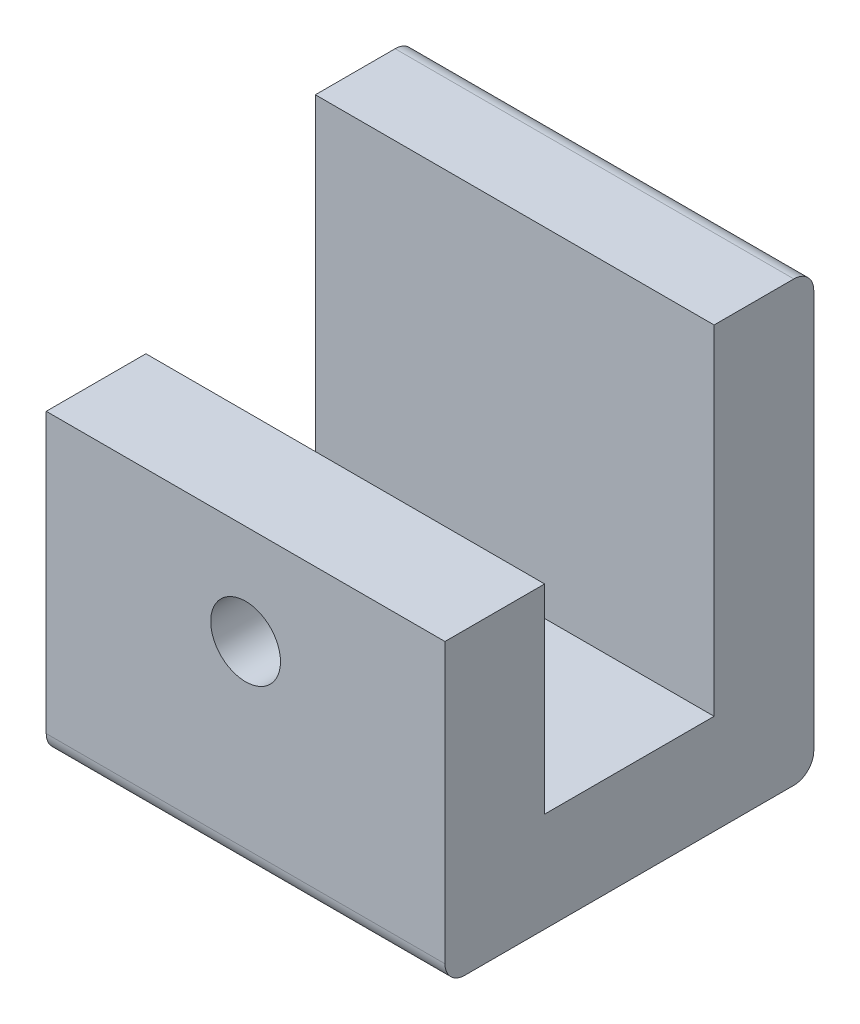
ISO-10303-21;
HEADER;
FILE_DESCRIPTION(('STEP AP214'),'2;1');
FILE_NAME('part.step','',(''),(''),'','','');
FILE_SCHEMA(('AUTOMOTIVE_DESIGN { 1 0 10303 214 1 1 1 1 }'));
ENDSEC;
DATA;
#1=APPLICATION_CONTEXT('core data for automotive mechanical design processes');
#2=APPLICATION_PROTOCOL_DEFINITION('international standard','automotive_design',2000,#1);
#3=PRODUCT_CONTEXT('',#1,'mechanical');
#4=PRODUCT('Part','Part','',(#3));
#5=PRODUCT_RELATED_PRODUCT_CATEGORY('part','',(#4));
#6=PRODUCT_DEFINITION_FORMATION('','',#4);
#7=PRODUCT_DEFINITION_CONTEXT('part definition',#1,'design');
#8=PRODUCT_DEFINITION('design','',#6,#7);
#9=PRODUCT_DEFINITION_SHAPE('','',#8);
#10=(LENGTH_UNIT() NAMED_UNIT(*) SI_UNIT(.MILLI.,.METRE.));
#11=(NAMED_UNIT(*) PLANE_ANGLE_UNIT() SI_UNIT($,.RADIAN.));
#12=(NAMED_UNIT(*) SI_UNIT($,.STERADIAN.) SOLID_ANGLE_UNIT());
#13=UNCERTAINTY_MEASURE_WITH_UNIT(LENGTH_MEASURE(1.E-05),#10,'distance_accuracy_value','');
#14=(GEOMETRIC_REPRESENTATION_CONTEXT(3) GLOBAL_UNCERTAINTY_ASSIGNED_CONTEXT((#13)) GLOBAL_UNIT_ASSIGNED_CONTEXT((#10,
#11,#12)) REPRESENTATION_CONTEXT('',''));
#15=CARTESIAN_POINT('',(0.,0.,0.));
#16=DIRECTION('',(0.,0.,1.));
#17=DIRECTION('',(1.,0.,0.));
#18=AXIS2_PLACEMENT_3D('',#15,#16,#17);
#19=CARTESIAN_POINT('',(10.,-2.5,-13.5));
#20=DIRECTION('',(0.,-1.,0.));
#21=DIRECTION('',(1.,0.,0.));
#22=AXIS2_PLACEMENT_3D('',#19,#20,#21);
#23=PLANE('',#22);
#24=DIRECTION('',(1.,0.,0.));
#25=VECTOR('',#24,1.);
#26=CARTESIAN_POINT('',(10.,-2.5,-8.5));
#27=LINE('',#26,#25);
#28=CARTESIAN_POINT('',(-10.,-2.5,-8.5));
#29=VERTEX_POINT('',#28);
#30=CARTESIAN_POINT('',(10.,-2.5,-8.5));
#31=VERTEX_POINT('',#30);
#32=EDGE_CURVE('E158',#29,#31,#27,.T.);
#33=ORIENTED_EDGE('',*,*,#32,.F.);
#34=DIRECTION('',(0.,0.,1.));
#35=VECTOR('',#34,1.);
#36=CARTESIAN_POINT('',(-10.,-2.5,-13.5));
#37=LINE('',#36,#35);
#38=CARTESIAN_POINT('',(-10.,-2.5,0.));
#39=VERTEX_POINT('',#38);
#40=EDGE_CURVE('E142',#29,#39,#37,.T.);
#41=ORIENTED_EDGE('',*,*,#40,.T.);
#42=DIRECTION('',(1.,0.,0.));
#43=VECTOR('',#42,1.);
#44=CARTESIAN_POINT('',(10.,-2.5,0.));
#45=LINE('',#44,#43);
#46=CARTESIAN_POINT('',(10.,-2.5,0.));
#47=VERTEX_POINT('',#46);
#48=EDGE_CURVE('E146',#39,#47,#45,.T.);
#49=ORIENTED_EDGE('',*,*,#48,.T.);
#50=DIRECTION('',(0.,0.,1.));
#51=VECTOR('',#50,1.);
#52=CARTESIAN_POINT('',(10.,-2.5,-13.5));
#53=LINE('',#52,#51);
#54=EDGE_CURVE('E169',#31,#47,#53,.T.);
#55=ORIENTED_EDGE('',*,*,#54,.F.);
#56=EDGE_LOOP('',(#33,#41,#49,#55));
#57=FACE_BOUND('',#56,.T.);
#58=ADVANCED_FACE('F41',(#57),#23,.F.);
#59=CARTESIAN_POINT('',(0.,0.,0.));
#60=DIRECTION('',(0.,0.,1.));
#61=DIRECTION('',(1.,0.,0.));
#62=AXIS2_PLACEMENT_3D('',#59,#60,#61);
#63=PLANE('',#62);
#64=CARTESIAN_POINT('',(0.,2.5,0.));
#65=DIRECTION('',(0.,0.,1.));
#66=DIRECTION('',(1.,0.,0.));
#67=AXIS2_PLACEMENT_3D('',#64,#65,#66);
#68=CIRCLE('',#67,1.75);
#69=CARTESIAN_POINT('',(1.75,2.5,0.));
#70=VERTEX_POINT('',#69);
#71=EDGE_CURVE('E177',#70,#70,#68,.T.);
#72=ORIENTED_EDGE('',*,*,#71,.T.);
#73=EDGE_LOOP('',(#72));
#74=FACE_BOUND('',#73,.T.);
#75=ORIENTED_EDGE('',*,*,#48,.F.);
#76=DIRECTION('',(0.,-1.,0.));
#77=VECTOR('',#76,1.);
#78=CARTESIAN_POINT('',(-10.,0.,0.));
#79=LINE('',#78,#77);
#80=CARTESIAN_POINT('',(-10.,7.5,0.));
#81=VERTEX_POINT('',#80);
#82=EDGE_CURVE('E197',#81,#39,#79,.T.);
#83=ORIENTED_EDGE('',*,*,#82,.F.);
#84=DIRECTION('',(-1.,0.,0.));
#85=VECTOR('',#84,1.);
#86=CARTESIAN_POINT('',(0.,7.5,0.));
#87=LINE('',#86,#85);
#88=CARTESIAN_POINT('',(10.,7.5,0.));
#89=VERTEX_POINT('',#88);
#90=EDGE_CURVE('E183',#89,#81,#87,.T.);
#91=ORIENTED_EDGE('',*,*,#90,.F.);
#92=DIRECTION('',(0.,-1.,0.));
#93=VECTOR('',#92,1.);
#94=CARTESIAN_POINT('',(10.,0.,0.));
#95=LINE('',#94,#93);
#96=EDGE_CURVE('E200',#89,#47,#95,.T.);
#97=ORIENTED_EDGE('',*,*,#96,.T.);
#98=EDGE_LOOP('',(#75,#83,#91,#97));
#99=FACE_BOUND('',#98,.T.);
#100=ADVANCED_FACE('F275',(#74,#99),#63,.F.);
#101=CARTESIAN_POINT('',(-10.,0.,5.));
#102=DIRECTION('',(1.,0.,0.));
#103=DIRECTION('',(0.,0.,-1.));
#104=AXIS2_PLACEMENT_3D('',#101,#102,#103);
#105=PLANE('',#104);
#106=DIRECTION('',(0.,0.,1.));
#107=VECTOR('',#106,1.);
#108=CARTESIAN_POINT('',(-10.,14.5,-13.5));
#109=LINE('',#108,#107);
#110=CARTESIAN_POINT('',(-10.,14.5,-12.5));
#111=VERTEX_POINT('',#110);
#112=CARTESIAN_POINT('',(-10.,14.5,-8.5));
#113=VERTEX_POINT('',#112);
#114=EDGE_CURVE('E125',#111,#113,#109,.T.);
#115=ORIENTED_EDGE('',*,*,#114,.F.);
#116=CARTESIAN_POINT('',(-10.,13.5,-12.5));
#117=DIRECTION('',(1.,0.,0.));
#118=DIRECTION('',(0.,0.,-1.));
#119=AXIS2_PLACEMENT_3D('',#116,#117,#118);
#120=CIRCLE('',#119,1.);
#121=CARTESIAN_POINT('',(-10.,13.5,-13.5));
#122=VERTEX_POINT('',#121);
#123=EDGE_CURVE('E226',#111,#122,#120,.F.);
#124=ORIENTED_EDGE('',*,*,#123,.T.);
#125=DIRECTION('',(0.,1.,0.));
#126=VECTOR('',#125,1.);
#127=CARTESIAN_POINT('',(-10.,-7.5,-13.5));
#128=LINE('',#127,#126);
#129=CARTESIAN_POINT('',(-10.,-6.5,-13.5));
#130=VERTEX_POINT('',#129);
#131=EDGE_CURVE('E165',#130,#122,#128,.T.);
#132=ORIENTED_EDGE('',*,*,#131,.F.);
#133=CARTESIAN_POINT('',(-10.,-6.5,-12.5));
#134=DIRECTION('',(1.,0.,0.));
#135=DIRECTION('',(0.,0.,-1.));
#136=AXIS2_PLACEMENT_3D('',#133,#134,#135);
#137=CIRCLE('',#136,1.);
#138=CARTESIAN_POINT('',(-10.,-7.5,-12.5));
#139=VERTEX_POINT('',#138);
#140=EDGE_CURVE('E223',#130,#139,#137,.F.);
#141=ORIENTED_EDGE('',*,*,#140,.T.);
#142=DIRECTION('',(0.,0.,-1.));
#143=VECTOR('',#142,1.);
#144=CARTESIAN_POINT('',(-10.,-7.5,5.));
#145=LINE('',#144,#143);
#146=CARTESIAN_POINT('',(-10.,-7.5,4.));
#147=VERTEX_POINT('',#146);
#148=EDGE_CURVE('E215',#147,#139,#145,.T.);
#149=ORIENTED_EDGE('',*,*,#148,.F.);
#150=CARTESIAN_POINT('',(-10.,-6.5,4.));
#151=DIRECTION('',(1.,0.,0.));
#152=DIRECTION('',(0.,0.,-1.));
#153=AXIS2_PLACEMENT_3D('',#150,#151,#152);
#154=CIRCLE('',#153,1.);
#155=CARTESIAN_POINT('',(-10.,-6.5,5.));
#156=VERTEX_POINT('',#155);
#157=EDGE_CURVE('E220',#147,#156,#154,.F.);
#158=ORIENTED_EDGE('',*,*,#157,.T.);
#159=DIRECTION('',(0.,-1.,0.));
#160=VECTOR('',#159,1.);
#161=CARTESIAN_POINT('',(-10.,0.,5.));
#162=LINE('',#161,#160);
#163=CARTESIAN_POINT('',(-10.,7.5,5.));
#164=VERTEX_POINT('',#163);
#165=EDGE_CURVE('E182',#164,#156,#162,.T.);
#166=ORIENTED_EDGE('',*,*,#165,.F.);
#167=DIRECTION('',(0.,0.,-1.));
#168=VECTOR('',#167,1.);
#169=CARTESIAN_POINT('',(-10.,7.5,5.));
#170=LINE('',#169,#168);
#171=EDGE_CURVE('E193',#164,#81,#170,.T.);
#172=ORIENTED_EDGE('',*,*,#171,.T.);
#173=ORIENTED_EDGE('',*,*,#82,.T.);
#174=ORIENTED_EDGE('',*,*,#40,.F.);
#175=DIRECTION('',(0.,-1.,0.));
#176=VECTOR('',#175,1.);
#177=CARTESIAN_POINT('',(-10.,14.5,-8.5));
#178=LINE('',#177,#176);
#179=EDGE_CURVE('E139',#113,#29,#178,.T.);
#180=ORIENTED_EDGE('',*,*,#179,.F.);
#181=EDGE_LOOP('',(#115,#124,#132,#141,#149,#158,#166,#172,#173,#174,#180));
#182=FACE_BOUND('',#181,.T.);
#183=ADVANCED_FACE('F140',(#182),#105,.F.);
#184=CARTESIAN_POINT('',(0.,-7.5,5.));
#185=DIRECTION('',(0.,-1.,0.));
#186=DIRECTION('',(1.,0.,0.));
#187=AXIS2_PLACEMENT_3D('',#184,#185,#186);
#188=PLANE('',#187);
#189=ORIENTED_EDGE('',*,*,#148,.T.);
#190=DIRECTION('',(-1.,0.,0.));
#191=VECTOR('',#190,1.);
#192=CARTESIAN_POINT('',(10.,-7.5,-12.5));
#193=LINE('',#192,#191);
#194=CARTESIAN_POINT('',(10.,-7.5,-12.5));
#195=VERTEX_POINT('',#194);
#196=EDGE_CURVE('E50',#139,#195,#193,.F.);
#197=ORIENTED_EDGE('',*,*,#196,.T.);
#198=DIRECTION('',(0.,0.,-1.));
#199=VECTOR('',#198,1.);
#200=CARTESIAN_POINT('',(10.,-7.5,5.));
#201=LINE('',#200,#199);
#202=CARTESIAN_POINT('',(10.,-7.5,4.));
#203=VERTEX_POINT('',#202);
#204=EDGE_CURVE('E212',#203,#195,#201,.T.);
#205=ORIENTED_EDGE('',*,*,#204,.F.);
#206=DIRECTION('',(-1.,0.,0.));
#207=VECTOR('',#206,1.);
#208=CARTESIAN_POINT('',(0.,-7.5,4.));
#209=LINE('',#208,#207);
#210=EDGE_CURVE('E244',#203,#147,#209,.T.);
#211=ORIENTED_EDGE('',*,*,#210,.T.);
#212=EDGE_LOOP('',(#189,#197,#205,#211));
#213=FACE_BOUND('',#212,.T.);
#214=ADVANCED_FACE('F250',(#213),#188,.T.);
#215=CARTESIAN_POINT('',(10.,0.,5.));
#216=DIRECTION('',(1.,0.,0.));
#217=DIRECTION('',(0.,1.,0.));
#218=AXIS2_PLACEMENT_3D('',#215,#216,#217);
#219=PLANE('',#218);
#220=DIRECTION('',(0.,-1.,0.));
#221=VECTOR('',#220,1.);
#222=CARTESIAN_POINT('',(10.,-7.5,-13.5));
#223=LINE('',#222,#221);
#224=CARTESIAN_POINT('',(10.,13.5,-13.5));
#225=VERTEX_POINT('',#224);
#226=CARTESIAN_POINT('',(10.,-6.5,-13.5));
#227=VERTEX_POINT('',#226);
#228=EDGE_CURVE('E161',#225,#227,#223,.T.);
#229=ORIENTED_EDGE('',*,*,#228,.F.);
#230=CARTESIAN_POINT('',(10.,13.5,-12.5));
#231=DIRECTION('',(1.,0.,0.));
#232=DIRECTION('',(0.,1.,0.));
#233=AXIS2_PLACEMENT_3D('',#230,#231,#232);
#234=CIRCLE('',#233,1.);
#235=CARTESIAN_POINT('',(10.,14.5,-12.5));
#236=VERTEX_POINT('',#235);
#237=EDGE_CURVE('E241',#225,#236,#234,.T.);
#238=ORIENTED_EDGE('',*,*,#237,.T.);
#239=DIRECTION('',(0.,0.,-1.));
#240=VECTOR('',#239,1.);
#241=CARTESIAN_POINT('',(10.,14.5,-13.5));
#242=LINE('',#241,#240);
#243=CARTESIAN_POINT('',(10.,14.5,-8.5));
#244=VERTEX_POINT('',#243);
#245=EDGE_CURVE('E136',#244,#236,#242,.T.);
#246=ORIENTED_EDGE('',*,*,#245,.F.);
#247=DIRECTION('',(0.,-1.,0.));
#248=VECTOR('',#247,1.);
#249=CARTESIAN_POINT('',(10.,14.5,-8.5));
#250=LINE('',#249,#248);
#251=EDGE_CURVE('E147',#244,#31,#250,.T.);
#252=ORIENTED_EDGE('',*,*,#251,.T.);
#253=ORIENTED_EDGE('',*,*,#54,.T.);
#254=ORIENTED_EDGE('',*,*,#96,.F.);
#255=DIRECTION('',(0.,0.,-1.));
#256=VECTOR('',#255,1.);
#257=CARTESIAN_POINT('',(10.,7.5,5.));
#258=LINE('',#257,#256);
#259=CARTESIAN_POINT('',(10.,7.5,5.));
#260=VERTEX_POINT('',#259);
#261=EDGE_CURVE('E209',#260,#89,#258,.T.);
#262=ORIENTED_EDGE('',*,*,#261,.F.);
#263=DIRECTION('',(0.,-1.,0.));
#264=VECTOR('',#263,1.);
#265=CARTESIAN_POINT('',(10.,0.,5.));
#266=LINE('',#265,#264);
#267=CARTESIAN_POINT('',(10.,-6.5,5.));
#268=VERTEX_POINT('',#267);
#269=EDGE_CURVE('E187',#260,#268,#266,.T.);
#270=ORIENTED_EDGE('',*,*,#269,.T.);
#271=CARTESIAN_POINT('',(10.,-6.5,4.));
#272=DIRECTION('',(1.,0.,0.));
#273=DIRECTION('',(0.,1.,0.));
#274=AXIS2_PLACEMENT_3D('',#271,#272,#273);
#275=CIRCLE('',#274,1.);
#276=EDGE_CURVE('E63',#268,#203,#275,.T.);
#277=ORIENTED_EDGE('',*,*,#276,.T.);
#278=ORIENTED_EDGE('',*,*,#204,.T.);
#279=CARTESIAN_POINT('',(10.,-6.5,-12.5));
#280=DIRECTION('',(1.,0.,0.));
#281=DIRECTION('',(0.,1.,0.));
#282=AXIS2_PLACEMENT_3D('',#279,#280,#281);
#283=CIRCLE('',#282,1.);
#284=EDGE_CURVE('E238',#195,#227,#283,.T.);
#285=ORIENTED_EDGE('',*,*,#284,.T.);
#286=EDGE_LOOP('',(#229,#238,#246,#252,#253,#254,#262,#270,#277,#278,#285));
#287=FACE_BOUND('',#286,.T.);
#288=ADVANCED_FACE('F263',(#287),#219,.T.);
#289=CARTESIAN_POINT('',(0.,2.5,5.));
#290=DIRECTION('',(0.,0.,-1.));
#291=DIRECTION('',(-1.,0.,0.));
#292=AXIS2_PLACEMENT_3D('',#289,#290,#291);
#293=CYLINDRICAL_SURFACE('',#292,1.75);
#294=CARTESIAN_POINT('',(0.,2.5,5.));
#295=DIRECTION('',(0.,0.,1.));
#296=DIRECTION('',(1.,0.,0.));
#297=AXIS2_PLACEMENT_3D('',#294,#295,#296);
#298=CIRCLE('',#297,1.75);
#299=CARTESIAN_POINT('',(1.75,2.5,5.));
#300=VERTEX_POINT('',#299);
#301=EDGE_CURVE('E178',#300,#300,#298,.T.);
#302=ORIENTED_EDGE('',*,*,#301,.T.);
#303=EDGE_LOOP('',(#302));
#304=FACE_BOUND('',#303,.T.);
#305=ORIENTED_EDGE('',*,*,#71,.F.);
#306=EDGE_LOOP('',(#305));
#307=FACE_BOUND('',#306,.T.);
#308=ADVANCED_FACE('F293',(#304,#307),#293,.F.);
#309=CARTESIAN_POINT('',(0.,7.5,5.));
#310=DIRECTION('',(0.,-1.,0.));
#311=DIRECTION('',(1.,0.,0.));
#312=AXIS2_PLACEMENT_3D('',#309,#310,#311);
#313=PLANE('',#312);
#314=ORIENTED_EDGE('',*,*,#90,.T.);
#315=ORIENTED_EDGE('',*,*,#171,.F.);
#316=DIRECTION('',(-1.,0.,0.));
#317=VECTOR('',#316,1.);
#318=CARTESIAN_POINT('',(0.,7.5,5.));
#319=LINE('',#318,#317);
#320=EDGE_CURVE('E190',#260,#164,#319,.T.);
#321=ORIENTED_EDGE('',*,*,#320,.F.);
#322=ORIENTED_EDGE('',*,*,#261,.T.);
#323=EDGE_LOOP('',(#314,#315,#321,#322));
#324=FACE_BOUND('',#323,.T.);
#325=ADVANCED_FACE('F288',(#324),#313,.F.);
#326=CARTESIAN_POINT('',(0.,0.,5.));
#327=DIRECTION('',(0.,0.,1.));
#328=DIRECTION('',(1.,0.,0.));
#329=AXIS2_PLACEMENT_3D('',#326,#327,#328);
#330=PLANE('',#329);
#331=ORIENTED_EDGE('',*,*,#301,.F.);
#332=EDGE_LOOP('',(#331));
#333=FACE_BOUND('',#332,.T.);
#334=ORIENTED_EDGE('',*,*,#165,.T.);
#335=DIRECTION('',(-1.,0.,0.));
#336=VECTOR('',#335,1.);
#337=CARTESIAN_POINT('',(0.,-6.5,5.));
#338=LINE('',#337,#336);
#339=EDGE_CURVE('E11',#156,#268,#338,.F.);
#340=ORIENTED_EDGE('',*,*,#339,.T.);
#341=ORIENTED_EDGE('',*,*,#269,.F.);
#342=ORIENTED_EDGE('',*,*,#320,.T.);
#343=EDGE_LOOP('',(#334,#340,#341,#342));
#344=FACE_BOUND('',#343,.T.);
#345=ADVANCED_FACE('F286',(#333,#344),#330,.T.);
#346=CARTESIAN_POINT('',(0.,0.,-13.5));
#347=DIRECTION('',(0.,0.,1.));
#348=DIRECTION('',(1.,0.,0.));
#349=AXIS2_PLACEMENT_3D('',#346,#347,#348);
#350=PLANE('',#349);
#351=ORIENTED_EDGE('',*,*,#131,.T.);
#352=DIRECTION('',(-1.,0.,0.));
#353=VECTOR('',#352,1.);
#354=CARTESIAN_POINT('',(0.,13.5,-13.5));
#355=LINE('',#354,#353);
#356=EDGE_CURVE('E233',#122,#225,#355,.F.);
#357=ORIENTED_EDGE('',*,*,#356,.T.);
#358=ORIENTED_EDGE('',*,*,#228,.T.);
#359=DIRECTION('',(-1.,0.,0.));
#360=VECTOR('',#359,1.);
#361=CARTESIAN_POINT('',(-10.,-6.5,-13.5));
#362=LINE('',#361,#360);
#363=EDGE_CURVE('E229',#227,#130,#362,.T.);
#364=ORIENTED_EDGE('',*,*,#363,.T.);
#365=EDGE_LOOP('',(#351,#357,#358,#364));
#366=FACE_BOUND('',#365,.T.);
#367=ADVANCED_FACE('F259',(#366),#350,.F.);
#368=CARTESIAN_POINT('',(10.,14.5,-8.5));
#369=DIRECTION('',(0.,0.,-1.));
#370=DIRECTION('',(-1.,0.,0.));
#371=AXIS2_PLACEMENT_3D('',#368,#369,#370);
#372=PLANE('',#371);
#373=ORIENTED_EDGE('',*,*,#32,.T.);
#374=ORIENTED_EDGE('',*,*,#251,.F.);
#375=DIRECTION('',(1.,0.,0.));
#376=VECTOR('',#375,1.);
#377=CARTESIAN_POINT('',(10.,14.5,-8.5));
#378=LINE('',#377,#376);
#379=EDGE_CURVE('E130',#113,#244,#378,.T.);
#380=ORIENTED_EDGE('',*,*,#379,.F.);
#381=ORIENTED_EDGE('',*,*,#179,.T.);
#382=EDGE_LOOP('',(#373,#374,#380,#381));
#383=FACE_BOUND('',#382,.T.);
#384=ADVANCED_FACE('F149',(#383),#372,.F.);
#385=CARTESIAN_POINT('',(0.,14.5,0.));
#386=DIRECTION('',(0.,-1.,0.));
#387=DIRECTION('',(1.,0.,0.));
#388=AXIS2_PLACEMENT_3D('',#385,#386,#387);
#389=PLANE('',#388);
#390=ORIENTED_EDGE('',*,*,#245,.T.);
#391=DIRECTION('',(-1.,0.,0.));
#392=VECTOR('',#391,1.);
#393=CARTESIAN_POINT('',(0.,14.5,-12.5));
#394=LINE('',#393,#392);
#395=EDGE_CURVE('E133',#236,#111,#394,.T.);
#396=ORIENTED_EDGE('',*,*,#395,.T.);
#397=ORIENTED_EDGE('',*,*,#114,.T.);
#398=ORIENTED_EDGE('',*,*,#379,.T.);
#399=EDGE_LOOP('',(#390,#396,#397,#398));
#400=FACE_BOUND('',#399,.T.);
#401=ADVANCED_FACE('F128',(#400),#389,.F.);
#402=CARTESIAN_POINT('',(0.,13.5,-12.5));
#403=DIRECTION('',(-1.,0.,0.));
#404=DIRECTION('',(0.,-1.,0.));
#405=AXIS2_PLACEMENT_3D('',#402,#403,#404);
#406=CYLINDRICAL_SURFACE('',#405,1.);
#407=ORIENTED_EDGE('',*,*,#237,.F.);
#408=ORIENTED_EDGE('',*,*,#356,.F.);
#409=ORIENTED_EDGE('',*,*,#123,.F.);
#410=ORIENTED_EDGE('',*,*,#395,.F.);
#411=EDGE_LOOP('',(#407,#408,#409,#410));
#412=FACE_BOUND('',#411,.T.);
#413=ADVANCED_FACE('F265',(#412),#406,.T.);
#414=CARTESIAN_POINT('',(0.,-6.5,-12.5));
#415=DIRECTION('',(1.,0.,0.));
#416=DIRECTION('',(0.,1.,0.));
#417=AXIS2_PLACEMENT_3D('',#414,#415,#416);
#418=CYLINDRICAL_SURFACE('',#417,1.);
#419=ORIENTED_EDGE('',*,*,#284,.F.);
#420=ORIENTED_EDGE('',*,*,#196,.F.);
#421=ORIENTED_EDGE('',*,*,#140,.F.);
#422=ORIENTED_EDGE('',*,*,#363,.F.);
#423=EDGE_LOOP('',(#419,#420,#421,#422));
#424=FACE_BOUND('',#423,.T.);
#425=ADVANCED_FACE('F257',(#424),#418,.T.);
#426=CARTESIAN_POINT('',(0.,-6.5,4.));
#427=DIRECTION('',(-1.,0.,0.));
#428=DIRECTION('',(0.,-1.,0.));
#429=AXIS2_PLACEMENT_3D('',#426,#427,#428);
#430=CYLINDRICAL_SURFACE('',#429,1.);
#431=ORIENTED_EDGE('',*,*,#276,.F.);
#432=ORIENTED_EDGE('',*,*,#339,.F.);
#433=ORIENTED_EDGE('',*,*,#157,.F.);
#434=ORIENTED_EDGE('',*,*,#210,.F.);
#435=EDGE_LOOP('',(#431,#432,#433,#434));
#436=FACE_BOUND('',#435,.T.);
#437=ADVANCED_FACE('F43',(#436),#430,.T.);
#438=CLOSED_SHELL('',(#58,#100,#183,#214,#288,#308,#325,#345,#367,#384,#401,#413,#425,#437));
#439=MANIFOLD_SOLID_BREP('B2',#438);
#440=ADVANCED_BREP_SHAPE_REPRESENTATION('',(#18,#439),#14);
#441=SHAPE_DEFINITION_REPRESENTATION(#9,#440);
ENDSEC;
END-ISO-10303-21;
